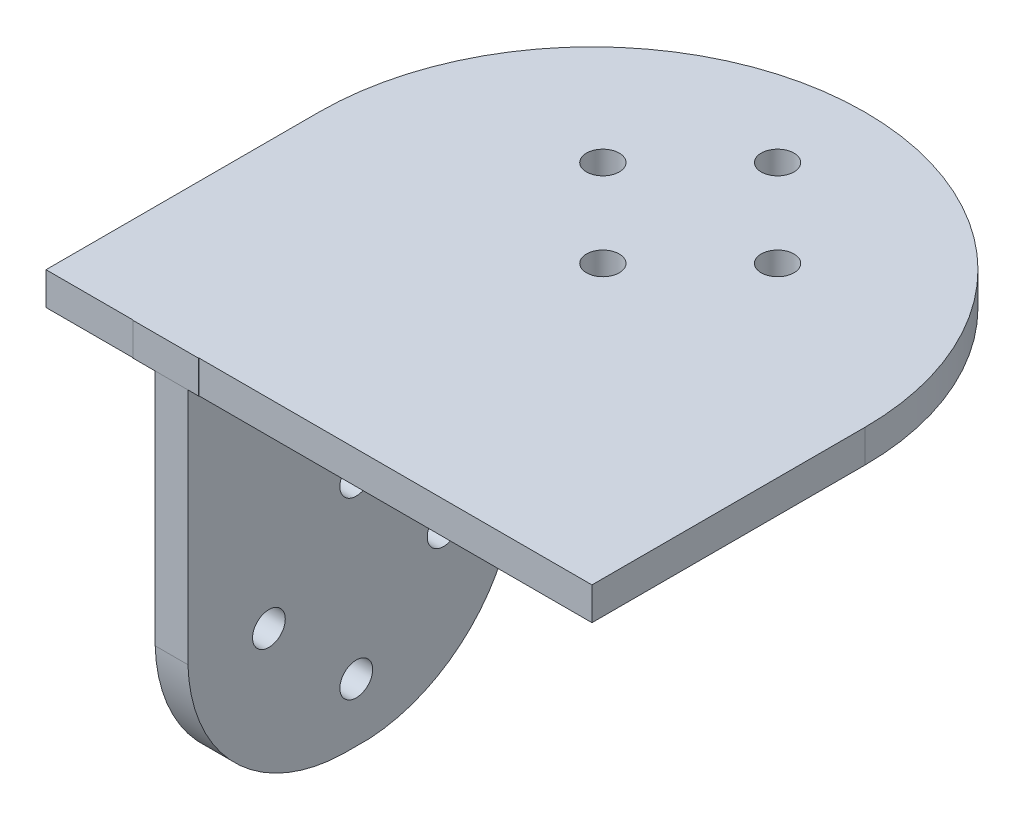
ISO-10303-21;
HEADER;
FILE_DESCRIPTION(('STEP AP214'),'2;1');
FILE_NAME('part.step','',(''),(''),'','','');
FILE_SCHEMA(('AUTOMOTIVE_DESIGN { 1 0 10303 214 1 1 1 1 }'));
ENDSEC;
DATA;
#1=APPLICATION_CONTEXT('core data for automotive mechanical design processes');
#2=APPLICATION_PROTOCOL_DEFINITION('international standard','automotive_design',2000,#1);
#3=PRODUCT_CONTEXT('',#1,'mechanical');
#4=PRODUCT('Part','Part','',(#3));
#5=PRODUCT_RELATED_PRODUCT_CATEGORY('part','',(#4));
#6=PRODUCT_DEFINITION_FORMATION('','',#4);
#7=PRODUCT_DEFINITION_CONTEXT('part definition',#1,'design');
#8=PRODUCT_DEFINITION('design','',#6,#7);
#9=PRODUCT_DEFINITION_SHAPE('','',#8);
#10=(LENGTH_UNIT() NAMED_UNIT(*) SI_UNIT(.MILLI.,.METRE.));
#11=(NAMED_UNIT(*) PLANE_ANGLE_UNIT() SI_UNIT($,.RADIAN.));
#12=(NAMED_UNIT(*) SI_UNIT($,.STERADIAN.) SOLID_ANGLE_UNIT());
#13=UNCERTAINTY_MEASURE_WITH_UNIT(LENGTH_MEASURE(1.E-05),#10,'distance_accuracy_value','');
#14=(GEOMETRIC_REPRESENTATION_CONTEXT(3) GLOBAL_UNCERTAINTY_ASSIGNED_CONTEXT((#13)) GLOBAL_UNIT_ASSIGNED_CONTEXT((#10,
#11,#12)) REPRESENTATION_CONTEXT('',''));
#15=CARTESIAN_POINT('',(0.,0.,0.));
#16=DIRECTION('',(0.,0.,1.));
#17=DIRECTION('',(1.,0.,0.));
#18=AXIS2_PLACEMENT_3D('',#15,#16,#17);
#19=CARTESIAN_POINT('',(25.,3.,25.));
#20=DIRECTION('',(0.,0.,-1.));
#21=DIRECTION('',(-1.,0.,0.));
#22=AXIS2_PLACEMENT_3D('',#19,#20,#21);
#23=PLANE('',#22);
#24=DIRECTION('',(1.,0.,0.));
#25=VECTOR('',#24,1.);
#26=CARTESIAN_POINT('',(25.,0.,25.));
#27=LINE('',#26,#25);
#28=CARTESIAN_POINT('',(-15.,0.,25.));
#29=VERTEX_POINT('',#28);
#30=CARTESIAN_POINT('',(-12.,0.,25.));
#31=VERTEX_POINT('',#30);
#32=EDGE_CURVE('E12',#29,#31,#27,.T.);
#33=ORIENTED_EDGE('',*,*,#32,.F.);
#34=DIRECTION('',(0.,1.,0.));
#35=VECTOR('',#34,1.);
#36=CARTESIAN_POINT('',(-15.,-36.,25.));
#37=LINE('',#36,#35);
#38=CARTESIAN_POINT('',(-15.,-21.8311766091495,25.));
#39=VERTEX_POINT('',#38);
#40=EDGE_CURVE('E260',#39,#29,#37,.T.);
#41=ORIENTED_EDGE('',*,*,#40,.F.);
#42=DIRECTION('',(1.,0.,0.));
#43=VECTOR('',#42,1.);
#44=CARTESIAN_POINT('',(-48.,-21.8311766091495,25.));
#45=LINE('',#44,#43);
#46=CARTESIAN_POINT('',(-12.,-21.8311766091495,25.));
#47=VERTEX_POINT('',#46);
#48=EDGE_CURVE('E229',#39,#47,#45,.T.);
#49=ORIENTED_EDGE('',*,*,#48,.T.);
#50=DIRECTION('',(0.,1.,0.));
#51=VECTOR('',#50,1.);
#52=CARTESIAN_POINT('',(-12.,-36.,25.));
#53=LINE('',#52,#51);
#54=EDGE_CURVE('E263',#47,#31,#53,.T.);
#55=ORIENTED_EDGE('',*,*,#54,.T.);
#56=EDGE_LOOP('',(#33,#41,#49,#55));
#57=FACE_BOUND('',#56,.T.);
#58=ADVANCED_FACE('F83',(#57),#23,.F.);
#59=DIRECTION('',(0.,1.,0.));
#60=VECTOR('',#59,1.);
#61=CARTESIAN_POINT('',(-11.,3.,25.));
#62=LINE('',#61,#60);
#63=CARTESIAN_POINT('',(-11.,0.,25.));
#64=VERTEX_POINT('',#63);
#65=CARTESIAN_POINT('',(-11.,3.,25.));
#66=VERTEX_POINT('',#65);
#67=EDGE_CURVE('E106',#64,#66,#62,.T.);
#68=ORIENTED_EDGE('',*,*,#67,.F.);
#69=DIRECTION('',(1.,0.,0.));
#70=VECTOR('',#69,1.);
#71=CARTESIAN_POINT('',(25.,0.,25.));
#72=LINE('',#71,#70);
#73=CARTESIAN_POINT('',(25.,0.,25.));
#74=VERTEX_POINT('',#73);
#75=EDGE_CURVE('E272',#64,#74,#72,.T.);
#76=ORIENTED_EDGE('',*,*,#75,.T.);
#77=DIRECTION('',(0.,-1.,0.));
#78=VECTOR('',#77,1.);
#79=CARTESIAN_POINT('',(25.,3.,25.));
#80=LINE('',#79,#78);
#81=CARTESIAN_POINT('',(25.,3.,25.));
#82=VERTEX_POINT('',#81);
#83=EDGE_CURVE('E318',#82,#74,#80,.T.);
#84=ORIENTED_EDGE('',*,*,#83,.F.);
#85=DIRECTION('',(1.,0.,0.));
#86=VECTOR('',#85,1.);
#87=CARTESIAN_POINT('',(25.,3.,25.));
#88=LINE('',#87,#86);
#89=EDGE_CURVE('E297',#66,#82,#88,.T.);
#90=ORIENTED_EDGE('',*,*,#89,.F.);
#91=EDGE_LOOP('',(#68,#76,#84,#90));
#92=FACE_BOUND('',#91,.T.);
#93=ADVANCED_FACE('F352',(#92),#23,.F.);
#94=CARTESIAN_POINT('',(-12.,-36.,0.));
#95=DIRECTION('',(-1.,0.,0.));
#96=DIRECTION('',(0.,0.,1.));
#97=AXIS2_PLACEMENT_3D('',#94,#95,#96);
#98=PLANE('',#97);
#99=CARTESIAN_POINT('',(-12.,-22.662353218597,1.58561866326079));
#100=DIRECTION('',(1.,0.,0.));
#101=DIRECTION('',(0.,0.,-1.));
#102=AXIS2_PLACEMENT_3D('',#99,#100,#101);
#103=CIRCLE('',#102,1.5);
#104=CARTESIAN_POINT('',(-12.,-22.662353218597,0.0856186632607896));
#105=VERTEX_POINT('',#104);
#106=EDGE_CURVE('E219',#105,#105,#103,.T.);
#107=ORIENTED_EDGE('',*,*,#106,.F.);
#108=EDGE_LOOP('',(#107));
#109=FACE_BOUND('',#108,.T.);
#110=CARTESIAN_POINT('',(-12.,-22.662353218597,17.5856186632608));
#111=DIRECTION('',(1.,0.,0.));
#112=DIRECTION('',(0.,0.,-1.));
#113=AXIS2_PLACEMENT_3D('',#110,#111,#112);
#114=CIRCLE('',#113,1.5);
#115=CARTESIAN_POINT('',(-12.,-22.662353218597,16.0856186632608));
#116=VERTEX_POINT('',#115);
#117=EDGE_CURVE('E215',#116,#116,#114,.T.);
#118=ORIENTED_EDGE('',*,*,#117,.F.);
#119=EDGE_LOOP('',(#118));
#120=FACE_BOUND('',#119,.T.);
#121=CARTESIAN_POINT('',(-12.,-30.662353218597,9.58561866326079));
#122=DIRECTION('',(1.,0.,0.));
#123=DIRECTION('',(0.,0.,-1.));
#124=AXIS2_PLACEMENT_3D('',#121,#122,#123);
#125=CIRCLE('',#124,1.5);
#126=CARTESIAN_POINT('',(-12.,-30.662353218597,8.08561866326079));
#127=VERTEX_POINT('',#126);
#128=EDGE_CURVE('E222',#127,#127,#125,.T.);
#129=ORIENTED_EDGE('',*,*,#128,.F.);
#130=EDGE_LOOP('',(#129));
#131=FACE_BOUND('',#130,.T.);
#132=ORIENTED_EDGE('',*,*,#54,.F.);
#133=CARTESIAN_POINT('',(-12.,-21.4155883033047,10.415588303375));
#134=DIRECTION('',(1.,0.,0.));
#135=DIRECTION('',(0.,0.,-1.));
#136=AXIS2_PLACEMENT_3D('',#133,#134,#135);
#137=CIRCLE('',#136,14.5903316678068);
#138=CARTESIAN_POINT('',(-12.,-36.,10.8311766067501));
#139=VERTEX_POINT('',#138);
#140=EDGE_CURVE('E227',#139,#47,#137,.F.);
#141=ORIENTED_EDGE('',*,*,#140,.F.);
#142=DIRECTION('',(0.,0.,1.));
#143=VECTOR('',#142,1.);
#144=CARTESIAN_POINT('',(-12.,-36.,0.));
#145=LINE('',#144,#143);
#146=CARTESIAN_POINT('',(-12.,-36.,8.33764678166806));
#147=VERTEX_POINT('',#146);
#148=EDGE_CURVE('E243',#147,#139,#145,.T.);
#149=ORIENTED_EDGE('',*,*,#148,.F.);
#150=CARTESIAN_POINT('',(-12.,-21.8311766091495,9.16882339083403));
#151=DIRECTION('',(1.,0.,0.));
#152=DIRECTION('',(0.,0.,-1.));
#153=AXIS2_PLACEMENT_3D('',#150,#151,#152);
#154=CIRCLE('',#153,14.1931818432915);
#155=CARTESIAN_POINT('',(-12.,-22.662353218597,-5.));
#156=VERTEX_POINT('',#155);
#157=EDGE_CURVE('E232',#156,#147,#154,.F.);
#158=ORIENTED_EDGE('',*,*,#157,.F.);
#159=DIRECTION('',(0.,1.,0.));
#160=VECTOR('',#159,1.);
#161=CARTESIAN_POINT('',(-12.,-36.,-5.));
#162=LINE('',#161,#160);
#163=CARTESIAN_POINT('',(-12.,0.,-5.));
#164=VERTEX_POINT('',#163);
#165=EDGE_CURVE('E266',#156,#164,#162,.T.);
#166=ORIENTED_EDGE('',*,*,#165,.T.);
#167=DIRECTION('',(0.,0.,1.));
#168=VECTOR('',#167,1.);
#169=CARTESIAN_POINT('',(-12.,0.,0.));
#170=LINE('',#169,#168);
#171=EDGE_CURVE('E254',#164,#31,#170,.T.);
#172=ORIENTED_EDGE('',*,*,#171,.T.);
#173=EDGE_LOOP('',(#132,#141,#149,#158,#166,#172));
#174=FACE_BOUND('',#173,.T.);
#175=CARTESIAN_POINT('',(-12.,-14.662353218597,9.58561866326079));
#176=DIRECTION('',(1.,0.,0.));
#177=DIRECTION('',(0.,0.,-1.));
#178=AXIS2_PLACEMENT_3D('',#175,#176,#177);
#179=CIRCLE('',#178,1.5);
#180=CARTESIAN_POINT('',(-12.,-14.662353218597,8.08561866326079));
#181=VERTEX_POINT('',#180);
#182=EDGE_CURVE('E218',#181,#181,#179,.T.);
#183=ORIENTED_EDGE('',*,*,#182,.F.);
#184=EDGE_LOOP('',(#183));
#185=FACE_BOUND('',#184,.T.);
#186=ADVANCED_FACE('F357',(#109,#120,#131,#174,#185),#98,.F.);
#187=CARTESIAN_POINT('',(-15.,-36.,0.));
#188=DIRECTION('',(1.,0.,0.));
#189=DIRECTION('',(0.,0.,-1.));
#190=AXIS2_PLACEMENT_3D('',#187,#188,#189);
#191=PLANE('',#190);
#192=CARTESIAN_POINT('',(-15.,-22.662353218597,1.58561866326079));
#193=DIRECTION('',(1.,0.,0.));
#194=DIRECTION('',(0.,0.,-1.));
#195=AXIS2_PLACEMENT_3D('',#192,#193,#194);
#196=CIRCLE('',#195,1.5);
#197=CARTESIAN_POINT('',(-15.,-22.662353218597,0.0856186632607896));
#198=VERTEX_POINT('',#197);
#199=EDGE_CURVE('E329',#198,#198,#196,.T.);
#200=ORIENTED_EDGE('',*,*,#199,.T.);
#201=EDGE_LOOP('',(#200));
#202=FACE_BOUND('',#201,.T.);
#203=CARTESIAN_POINT('',(-15.,-22.662353218597,17.5856186632608));
#204=DIRECTION('',(1.,0.,0.));
#205=DIRECTION('',(0.,0.,-1.));
#206=AXIS2_PLACEMENT_3D('',#203,#204,#205);
#207=CIRCLE('',#206,1.5);
#208=CARTESIAN_POINT('',(-15.,-22.662353218597,16.0856186632608));
#209=VERTEX_POINT('',#208);
#210=EDGE_CURVE('E242',#209,#209,#207,.T.);
#211=ORIENTED_EDGE('',*,*,#210,.T.);
#212=EDGE_LOOP('',(#211));
#213=FACE_BOUND('',#212,.T.);
#214=CARTESIAN_POINT('',(-15.,-30.662353218597,9.58561866326079));
#215=DIRECTION('',(1.,0.,0.));
#216=DIRECTION('',(0.,0.,-1.));
#217=AXIS2_PLACEMENT_3D('',#214,#215,#216);
#218=CIRCLE('',#217,1.5);
#219=CARTESIAN_POINT('',(-15.,-30.662353218597,8.08561866326079));
#220=VERTEX_POINT('',#219);
#221=EDGE_CURVE('E326',#220,#220,#218,.T.);
#222=ORIENTED_EDGE('',*,*,#221,.T.);
#223=EDGE_LOOP('',(#222));
#224=FACE_BOUND('',#223,.T.);
#225=DIRECTION('',(0.,0.,-1.));
#226=VECTOR('',#225,1.);
#227=CARTESIAN_POINT('',(-15.,-36.,0.));
#228=LINE('',#227,#226);
#229=CARTESIAN_POINT('',(-15.,-36.,10.8311766067501));
#230=VERTEX_POINT('',#229);
#231=CARTESIAN_POINT('',(-15.,-36.,8.33764678166806));
#232=VERTEX_POINT('',#231);
#233=EDGE_CURVE('E246',#230,#232,#228,.T.);
#234=ORIENTED_EDGE('',*,*,#233,.F.);
#235=CARTESIAN_POINT('',(-15.,-21.4155883033047,10.415588303375));
#236=DIRECTION('',(1.,0.,0.));
#237=DIRECTION('',(0.,0.,-1.));
#238=AXIS2_PLACEMENT_3D('',#235,#236,#237);
#239=CIRCLE('',#238,14.5903316678068);
#240=EDGE_CURVE('E239',#230,#39,#239,.F.);
#241=ORIENTED_EDGE('',*,*,#240,.T.);
#242=ORIENTED_EDGE('',*,*,#40,.T.);
#243=DIRECTION('',(0.,0.,-1.));
#244=VECTOR('',#243,1.);
#245=CARTESIAN_POINT('',(-15.,0.,0.));
#246=LINE('',#245,#244);
#247=CARTESIAN_POINT('',(-15.,0.,-5.));
#248=VERTEX_POINT('',#247);
#249=EDGE_CURVE('E247',#29,#248,#246,.T.);
#250=ORIENTED_EDGE('',*,*,#249,.T.);
#251=DIRECTION('',(0.,1.,0.));
#252=VECTOR('',#251,1.);
#253=CARTESIAN_POINT('',(-15.,-36.,-5.));
#254=LINE('',#253,#252);
#255=CARTESIAN_POINT('',(-15.,-22.662353218597,-5.));
#256=VERTEX_POINT('',#255);
#257=EDGE_CURVE('E250',#256,#248,#254,.T.);
#258=ORIENTED_EDGE('',*,*,#257,.F.);
#259=CARTESIAN_POINT('',(-15.,-21.8311766091495,9.16882339083403));
#260=DIRECTION('',(1.,0.,0.));
#261=DIRECTION('',(0.,0.,-1.));
#262=AXIS2_PLACEMENT_3D('',#259,#260,#261);
#263=CIRCLE('',#262,14.1931818432915);
#264=EDGE_CURVE('E236',#256,#232,#263,.F.);
#265=ORIENTED_EDGE('',*,*,#264,.T.);
#266=EDGE_LOOP('',(#234,#241,#242,#250,#258,#265));
#267=FACE_BOUND('',#266,.T.);
#268=CARTESIAN_POINT('',(-15.,-14.662353218597,9.58561866326079));
#269=DIRECTION('',(1.,0.,0.));
#270=DIRECTION('',(0.,0.,-1.));
#271=AXIS2_PLACEMENT_3D('',#268,#269,#270);
#272=CIRCLE('',#271,1.5);
#273=CARTESIAN_POINT('',(-15.,-14.662353218597,8.08561866326079));
#274=VERTEX_POINT('',#273);
#275=EDGE_CURVE('E255',#274,#274,#272,.T.);
#276=ORIENTED_EDGE('',*,*,#275,.T.);
#277=EDGE_LOOP('',(#276));
#278=FACE_BOUND('',#277,.T.);
#279=ADVANCED_FACE('F334',(#202,#213,#224,#267,#278),#191,.F.);
#280=CARTESIAN_POINT('',(0.,0.,0.));
#281=DIRECTION('',(0.,1.,0.));
#282=DIRECTION('',(0.,0.,1.));
#283=AXIS2_PLACEMENT_3D('',#280,#281,#282);
#284=PLANE('',#283);
#285=DIRECTION('',(1.,0.,0.));
#286=VECTOR('',#285,1.);
#287=CARTESIAN_POINT('',(0.,0.,-5.));
#288=LINE('',#287,#286);
#289=EDGE_CURVE('E251',#248,#164,#288,.T.);
#290=ORIENTED_EDGE('',*,*,#289,.F.);
#291=ORIENTED_EDGE('',*,*,#249,.F.);
#292=ORIENTED_EDGE('',*,*,#32,.T.);
#293=ORIENTED_EDGE('',*,*,#171,.F.);
#294=EDGE_LOOP('',(#290,#291,#292,#293));
#295=FACE_BOUND('',#294,.T.);
#296=DIRECTION('',(0.,0.,1.));
#297=VECTOR('',#296,1.);
#298=CARTESIAN_POINT('',(-17.,0.,0.));
#299=LINE('',#298,#297);
#300=CARTESIAN_POINT('',(-17.,0.,25.));
#301=VERTEX_POINT('',#300);
#302=CARTESIAN_POINT('',(-17.,0.,25.0332934627977));
#303=VERTEX_POINT('',#302);
#304=EDGE_CURVE('E184',#301,#303,#299,.T.);
#305=ORIENTED_EDGE('',*,*,#304,.F.);
#306=CARTESIAN_POINT('',(-25.,0.,25.));
#307=VERTEX_POINT('',#306);
#308=EDGE_CURVE('E98',#307,#301,#72,.T.);
#309=ORIENTED_EDGE('',*,*,#308,.F.);
#310=DIRECTION('',(0.,0.,1.));
#311=VECTOR('',#310,1.);
#312=CARTESIAN_POINT('',(-25.,0.,0.));
#313=LINE('',#312,#311);
#314=CARTESIAN_POINT('',(-25.,0.,0.));
#315=VERTEX_POINT('',#314);
#316=EDGE_CURVE('E309',#315,#307,#313,.T.);
#317=ORIENTED_EDGE('',*,*,#316,.F.);
#318=CARTESIAN_POINT('',(0.,0.,0.));
#319=DIRECTION('',(0.,1.,0.));
#320=DIRECTION('',(0.,0.,1.));
#321=AXIS2_PLACEMENT_3D('',#318,#319,#320);
#322=CIRCLE('',#321,25.);
#323=CARTESIAN_POINT('',(25.,0.,0.));
#324=VERTEX_POINT('',#323);
#325=EDGE_CURVE('E307',#324,#315,#322,.T.);
#326=ORIENTED_EDGE('',*,*,#325,.F.);
#327=DIRECTION('',(0.,0.,-1.));
#328=VECTOR('',#327,1.);
#329=CARTESIAN_POINT('',(25.,0.,0.));
#330=LINE('',#329,#328);
#331=EDGE_CURVE('E305',#74,#324,#330,.T.);
#332=ORIENTED_EDGE('',*,*,#331,.F.);
#333=ORIENTED_EDGE('',*,*,#75,.F.);
#334=DIRECTION('',(0.,0.,1.));
#335=VECTOR('',#334,1.);
#336=CARTESIAN_POINT('',(-11.,0.,0.));
#337=LINE('',#336,#335);
#338=CARTESIAN_POINT('',(-11.,0.,25.0332934627977));
#339=VERTEX_POINT('',#338);
#340=EDGE_CURVE('E207',#64,#339,#337,.T.);
#341=ORIENTED_EDGE('',*,*,#340,.T.);
#342=DIRECTION('',(1.,0.,0.));
#343=VECTOR('',#342,1.);
#344=CARTESIAN_POINT('',(-17.,0.,25.0332934627977));
#345=LINE('',#344,#343);
#346=EDGE_CURVE('E198',#303,#339,#345,.T.);
#347=ORIENTED_EDGE('',*,*,#346,.F.);
#348=EDGE_LOOP('',(#305,#309,#317,#326,#332,#333,#341,#347));
#349=FACE_BOUND('',#348,.T.);
#350=CARTESIAN_POINT('',(-8.,0.,-9.));
#351=DIRECTION('',(0.,-1.,0.));
#352=DIRECTION('',(0.,0.,-1.));
#353=AXIS2_PLACEMENT_3D('',#350,#351,#352);
#354=CIRCLE('',#353,1.5);
#355=CARTESIAN_POINT('',(-8.,0.,-10.5));
#356=VERTEX_POINT('',#355);
#357=EDGE_CURVE('E273',#356,#356,#354,.T.);
#358=ORIENTED_EDGE('',*,*,#357,.F.);
#359=EDGE_LOOP('',(#358));
#360=FACE_BOUND('',#359,.T.);
#361=CARTESIAN_POINT('',(0.,0.,-0.999999999999999));
#362=DIRECTION('',(0.,-1.,0.));
#363=DIRECTION('',(0.,0.,-1.));
#364=AXIS2_PLACEMENT_3D('',#361,#362,#363);
#365=CIRCLE('',#364,1.5);
#366=CARTESIAN_POINT('',(0.,0.,-2.5));
#367=VERTEX_POINT('',#366);
#368=EDGE_CURVE('E276',#367,#367,#365,.T.);
#369=ORIENTED_EDGE('',*,*,#368,.F.);
#370=EDGE_LOOP('',(#369));
#371=FACE_BOUND('',#370,.T.);
#372=CARTESIAN_POINT('',(0.,0.,-17.));
#373=DIRECTION('',(0.,-1.,0.));
#374=DIRECTION('',(0.,0.,-1.));
#375=AXIS2_PLACEMENT_3D('',#372,#373,#374);
#376=CIRCLE('',#375,1.5);
#377=CARTESIAN_POINT('',(0.,0.,-18.5));
#378=VERTEX_POINT('',#377);
#379=EDGE_CURVE('E282',#378,#378,#376,.T.);
#380=ORIENTED_EDGE('',*,*,#379,.F.);
#381=EDGE_LOOP('',(#380));
#382=FACE_BOUND('',#381,.T.);
#383=CARTESIAN_POINT('',(8.,0.,-9.));
#384=DIRECTION('',(0.,-1.,0.));
#385=DIRECTION('',(0.,0.,-1.));
#386=AXIS2_PLACEMENT_3D('',#383,#384,#385);
#387=CIRCLE('',#386,1.5);
#388=CARTESIAN_POINT('',(8.,0.,-10.5));
#389=VERTEX_POINT('',#388);
#390=EDGE_CURVE('E288',#389,#389,#387,.T.);
#391=ORIENTED_EDGE('',*,*,#390,.F.);
#392=EDGE_LOOP('',(#391));
#393=FACE_BOUND('',#392,.T.);
#394=ADVANCED_FACE('F204',(#295,#349,#360,#371,#382,#393),#284,.F.);
#395=ORIENTED_EDGE('',*,*,#308,.T.);
#396=DIRECTION('',(0.,1.,0.));
#397=VECTOR('',#396,1.);
#398=CARTESIAN_POINT('',(-17.,3.,25.));
#399=LINE('',#398,#397);
#400=CARTESIAN_POINT('',(-17.,3.,25.));
#401=VERTEX_POINT('',#400);
#402=EDGE_CURVE('E190',#301,#401,#399,.T.);
#403=ORIENTED_EDGE('',*,*,#402,.T.);
#404=CARTESIAN_POINT('',(-25.,3.,25.));
#405=VERTEX_POINT('',#404);
#406=EDGE_CURVE('E293',#405,#401,#88,.T.);
#407=ORIENTED_EDGE('',*,*,#406,.F.);
#408=DIRECTION('',(0.,-1.,0.));
#409=VECTOR('',#408,1.);
#410=CARTESIAN_POINT('',(-25.,3.,25.));
#411=LINE('',#410,#409);
#412=EDGE_CURVE('E303',#405,#307,#411,.T.);
#413=ORIENTED_EDGE('',*,*,#412,.T.);
#414=EDGE_LOOP('',(#395,#403,#407,#413));
#415=FACE_BOUND('',#414,.T.);
#416=ADVANCED_FACE('F85',(#415),#23,.F.);
#417=CARTESIAN_POINT('',(25.,3.,0.));
#418=DIRECTION('',(-1.,0.,0.));
#419=DIRECTION('',(0.,0.,1.));
#420=AXIS2_PLACEMENT_3D('',#417,#418,#419);
#421=PLANE('',#420);
#422=ORIENTED_EDGE('',*,*,#331,.T.);
#423=DIRECTION('',(0.,-1.,0.));
#424=VECTOR('',#423,1.);
#425=CARTESIAN_POINT('',(25.,3.,0.));
#426=LINE('',#425,#424);
#427=CARTESIAN_POINT('',(25.,3.,0.));
#428=VERTEX_POINT('',#427);
#429=EDGE_CURVE('E315',#428,#324,#426,.T.);
#430=ORIENTED_EDGE('',*,*,#429,.F.);
#431=DIRECTION('',(0.,0.,-1.));
#432=VECTOR('',#431,1.);
#433=CARTESIAN_POINT('',(25.,3.,0.));
#434=LINE('',#433,#432);
#435=EDGE_CURVE('E296',#82,#428,#434,.T.);
#436=ORIENTED_EDGE('',*,*,#435,.F.);
#437=ORIENTED_EDGE('',*,*,#83,.T.);
#438=EDGE_LOOP('',(#422,#430,#436,#437));
#439=FACE_BOUND('',#438,.T.);
#440=ADVANCED_FACE('F359',(#439),#421,.F.);
#441=CARTESIAN_POINT('',(0.,3.,0.));
#442=DIRECTION('',(0.,-1.,0.));
#443=DIRECTION('',(0.,0.,-1.));
#444=AXIS2_PLACEMENT_3D('',#441,#442,#443);
#445=CYLINDRICAL_SURFACE('',#444,25.);
#446=ORIENTED_EDGE('',*,*,#325,.T.);
#447=DIRECTION('',(0.,-1.,0.));
#448=VECTOR('',#447,1.);
#449=CARTESIAN_POINT('',(-25.,3.,0.));
#450=LINE('',#449,#448);
#451=CARTESIAN_POINT('',(-25.,3.,0.));
#452=VERTEX_POINT('',#451);
#453=EDGE_CURVE('E312',#452,#315,#450,.T.);
#454=ORIENTED_EDGE('',*,*,#453,.F.);
#455=CARTESIAN_POINT('',(0.,3.,0.));
#456=DIRECTION('',(0.,1.,0.));
#457=DIRECTION('',(0.,0.,1.));
#458=AXIS2_PLACEMENT_3D('',#455,#456,#457);
#459=CIRCLE('',#458,25.);
#460=EDGE_CURVE('E299',#428,#452,#459,.T.);
#461=ORIENTED_EDGE('',*,*,#460,.F.);
#462=ORIENTED_EDGE('',*,*,#429,.T.);
#463=EDGE_LOOP('',(#446,#454,#461,#462));
#464=FACE_BOUND('',#463,.T.);
#465=ADVANCED_FACE('F364',(#464),#445,.T.);
#466=CARTESIAN_POINT('',(-25.,3.,0.));
#467=DIRECTION('',(1.,0.,0.));
#468=DIRECTION('',(0.,0.,-1.));
#469=AXIS2_PLACEMENT_3D('',#466,#467,#468);
#470=PLANE('',#469);
#471=ORIENTED_EDGE('',*,*,#316,.T.);
#472=ORIENTED_EDGE('',*,*,#412,.F.);
#473=DIRECTION('',(0.,0.,1.));
#474=VECTOR('',#473,1.);
#475=CARTESIAN_POINT('',(-25.,3.,0.));
#476=LINE('',#475,#474);
#477=EDGE_CURVE('E301',#452,#405,#476,.T.);
#478=ORIENTED_EDGE('',*,*,#477,.F.);
#479=ORIENTED_EDGE('',*,*,#453,.T.);
#480=EDGE_LOOP('',(#471,#472,#478,#479));
#481=FACE_BOUND('',#480,.T.);
#482=ADVANCED_FACE('F378',(#481),#470,.F.);
#483=CARTESIAN_POINT('',(0.,3.,0.));
#484=DIRECTION('',(0.,1.,0.));
#485=DIRECTION('',(0.,0.,1.));
#486=AXIS2_PLACEMENT_3D('',#483,#484,#485);
#487=PLANE('',#486);
#488=ORIENTED_EDGE('',*,*,#406,.T.);
#489=DIRECTION('',(0.,0.,-1.));
#490=VECTOR('',#489,1.);
#491=CARTESIAN_POINT('',(-17.,3.,0.));
#492=LINE('',#491,#490);
#493=CARTESIAN_POINT('',(-17.,3.,25.0332934627977));
#494=VERTEX_POINT('',#493);
#495=EDGE_CURVE('E202',#494,#401,#492,.T.);
#496=ORIENTED_EDGE('',*,*,#495,.F.);
#497=DIRECTION('',(1.,0.,0.));
#498=VECTOR('',#497,1.);
#499=CARTESIAN_POINT('',(-17.,3.,25.0332934627977));
#500=LINE('',#499,#498);
#501=CARTESIAN_POINT('',(-11.,3.,25.0332934627977));
#502=VERTEX_POINT('',#501);
#503=EDGE_CURVE('E200',#494,#502,#500,.T.);
#504=ORIENTED_EDGE('',*,*,#503,.T.);
#505=DIRECTION('',(0.,0.,-1.));
#506=VECTOR('',#505,1.);
#507=CARTESIAN_POINT('',(-11.,3.,0.));
#508=LINE('',#507,#506);
#509=EDGE_CURVE('E193',#502,#66,#508,.T.);
#510=ORIENTED_EDGE('',*,*,#509,.T.);
#511=ORIENTED_EDGE('',*,*,#89,.T.);
#512=ORIENTED_EDGE('',*,*,#435,.T.);
#513=ORIENTED_EDGE('',*,*,#460,.T.);
#514=ORIENTED_EDGE('',*,*,#477,.T.);
#515=EDGE_LOOP('',(#488,#496,#504,#510,#511,#512,#513,#514));
#516=FACE_BOUND('',#515,.T.);
#517=CARTESIAN_POINT('',(-8.,3.,-9.));
#518=DIRECTION('',(0.,-1.,0.));
#519=DIRECTION('',(0.,0.,-1.));
#520=AXIS2_PLACEMENT_3D('',#517,#518,#519);
#521=CIRCLE('',#520,1.5);
#522=CARTESIAN_POINT('',(-8.,3.,-10.5));
#523=VERTEX_POINT('',#522);
#524=EDGE_CURVE('E269',#523,#523,#521,.T.);
#525=ORIENTED_EDGE('',*,*,#524,.T.);
#526=EDGE_LOOP('',(#525));
#527=FACE_BOUND('',#526,.T.);
#528=CARTESIAN_POINT('',(0.,3.,-0.999999999999999));
#529=DIRECTION('',(0.,-1.,0.));
#530=DIRECTION('',(0.,0.,-1.));
#531=AXIS2_PLACEMENT_3D('',#528,#529,#530);
#532=CIRCLE('',#531,1.5);
#533=CARTESIAN_POINT('',(0.,3.,-2.5));
#534=VERTEX_POINT('',#533);
#535=EDGE_CURVE('E279',#534,#534,#532,.T.);
#536=ORIENTED_EDGE('',*,*,#535,.T.);
#537=EDGE_LOOP('',(#536));
#538=FACE_BOUND('',#537,.T.);
#539=CARTESIAN_POINT('',(0.,3.,-17.));
#540=DIRECTION('',(0.,-1.,0.));
#541=DIRECTION('',(0.,0.,-1.));
#542=AXIS2_PLACEMENT_3D('',#539,#540,#541);
#543=CIRCLE('',#542,1.5);
#544=CARTESIAN_POINT('',(0.,3.,-18.5));
#545=VERTEX_POINT('',#544);
#546=EDGE_CURVE('E285',#545,#545,#543,.T.);
#547=ORIENTED_EDGE('',*,*,#546,.T.);
#548=EDGE_LOOP('',(#547));
#549=FACE_BOUND('',#548,.T.);
#550=CARTESIAN_POINT('',(8.,3.,-9.));
#551=DIRECTION('',(0.,-1.,0.));
#552=DIRECTION('',(0.,0.,-1.));
#553=AXIS2_PLACEMENT_3D('',#550,#551,#552);
#554=CIRCLE('',#553,1.5);
#555=CARTESIAN_POINT('',(8.,3.,-10.5));
#556=VERTEX_POINT('',#555);
#557=EDGE_CURVE('E268',#556,#556,#554,.T.);
#558=ORIENTED_EDGE('',*,*,#557,.T.);
#559=EDGE_LOOP('',(#558));
#560=FACE_BOUND('',#559,.T.);
#561=ADVANCED_FACE('F376',(#516,#527,#538,#549,#560),#487,.T.);
#562=CARTESIAN_POINT('',(8.,3.,-9.));
#563=DIRECTION('',(0.,-1.,0.));
#564=DIRECTION('',(0.,0.,-1.));
#565=AXIS2_PLACEMENT_3D('',#562,#563,#564);
#566=CYLINDRICAL_SURFACE('',#565,1.5);
#567=ORIENTED_EDGE('',*,*,#557,.F.);
#568=EDGE_LOOP('',(#567));
#569=FACE_BOUND('',#568,.T.);
#570=ORIENTED_EDGE('',*,*,#390,.T.);
#571=EDGE_LOOP('',(#570));
#572=FACE_BOUND('',#571,.T.);
#573=ADVANCED_FACE('F474',(#569,#572),#566,.F.);
#574=CARTESIAN_POINT('',(0.,3.,-17.));
#575=DIRECTION('',(0.,-1.,0.));
#576=DIRECTION('',(0.,0.,-1.));
#577=AXIS2_PLACEMENT_3D('',#574,#575,#576);
#578=CYLINDRICAL_SURFACE('',#577,1.5);
#579=ORIENTED_EDGE('',*,*,#546,.F.);
#580=EDGE_LOOP('',(#579));
#581=FACE_BOUND('',#580,.T.);
#582=ORIENTED_EDGE('',*,*,#379,.T.);
#583=EDGE_LOOP('',(#582));
#584=FACE_BOUND('',#583,.T.);
#585=ADVANCED_FACE('F471',(#581,#584),#578,.F.);
#586=CARTESIAN_POINT('',(0.,3.,-0.999999999999999));
#587=DIRECTION('',(0.,-1.,0.));
#588=DIRECTION('',(0.,0.,-1.));
#589=AXIS2_PLACEMENT_3D('',#586,#587,#588);
#590=CYLINDRICAL_SURFACE('',#589,1.5);
#591=ORIENTED_EDGE('',*,*,#535,.F.);
#592=EDGE_LOOP('',(#591));
#593=FACE_BOUND('',#592,.T.);
#594=ORIENTED_EDGE('',*,*,#368,.T.);
#595=EDGE_LOOP('',(#594));
#596=FACE_BOUND('',#595,.T.);
#597=ADVANCED_FACE('F467',(#593,#596),#590,.F.);
#598=CARTESIAN_POINT('',(-8.,3.,-9.));
#599=DIRECTION('',(0.,-1.,0.));
#600=DIRECTION('',(0.,0.,-1.));
#601=AXIS2_PLACEMENT_3D('',#598,#599,#600);
#602=CYLINDRICAL_SURFACE('',#601,1.5);
#603=ORIENTED_EDGE('',*,*,#524,.F.);
#604=EDGE_LOOP('',(#603));
#605=FACE_BOUND('',#604,.T.);
#606=ORIENTED_EDGE('',*,*,#357,.T.);
#607=EDGE_LOOP('',(#606));
#608=FACE_BOUND('',#607,.T.);
#609=ADVANCED_FACE('F464',(#605,#608),#602,.F.);
#610=CARTESIAN_POINT('',(0.,-36.,-5.));
#611=DIRECTION('',(0.,0.,1.));
#612=DIRECTION('',(1.,0.,0.));
#613=AXIS2_PLACEMENT_3D('',#610,#611,#612);
#614=PLANE('',#613);
#615=ORIENTED_EDGE('',*,*,#165,.F.);
#616=DIRECTION('',(1.,0.,0.));
#617=VECTOR('',#616,1.);
#618=CARTESIAN_POINT('',(-48.,-22.662353218597,-5.));
#619=LINE('',#618,#617);
#620=EDGE_CURVE('E234',#256,#156,#619,.T.);
#621=ORIENTED_EDGE('',*,*,#620,.F.);
#622=ORIENTED_EDGE('',*,*,#257,.T.);
#623=ORIENTED_EDGE('',*,*,#289,.T.);
#624=EDGE_LOOP('',(#615,#621,#622,#623));
#625=FACE_BOUND('',#624,.T.);
#626=ADVANCED_FACE('F450',(#625),#614,.F.);
#627=CARTESIAN_POINT('',(0.,-36.,0.));
#628=DIRECTION('',(0.,-1.,0.));
#629=DIRECTION('',(0.,0.,-1.));
#630=AXIS2_PLACEMENT_3D('',#627,#628,#629);
#631=PLANE('',#630);
#632=DIRECTION('',(1.,0.,0.));
#633=VECTOR('',#632,1.);
#634=CARTESIAN_POINT('',(-48.,-36.,10.8311766067501));
#635=LINE('',#634,#633);
#636=EDGE_CURVE('E91',#230,#139,#635,.T.);
#637=ORIENTED_EDGE('',*,*,#636,.F.);
#638=ORIENTED_EDGE('',*,*,#233,.T.);
#639=DIRECTION('',(1.,0.,0.));
#640=VECTOR('',#639,1.);
#641=CARTESIAN_POINT('',(-48.,-36.,8.33764678166806));
#642=LINE('',#641,#640);
#643=EDGE_CURVE('E321',#147,#232,#642,.F.);
#644=ORIENTED_EDGE('',*,*,#643,.F.);
#645=ORIENTED_EDGE('',*,*,#148,.T.);
#646=EDGE_LOOP('',(#637,#638,#644,#645));
#647=FACE_BOUND('',#646,.T.);
#648=ADVANCED_FACE('F438',(#647),#631,.T.);
#649=CARTESIAN_POINT('',(-48.,-21.8311766091495,9.16882339083403));
#650=DIRECTION('',(1.,0.,0.));
#651=DIRECTION('',(0.,0.,-1.));
#652=AXIS2_PLACEMENT_3D('',#649,#650,#651);
#653=CYLINDRICAL_SURFACE('',#652,14.1931818432915);
#654=ORIENTED_EDGE('',*,*,#620,.T.);
#655=ORIENTED_EDGE('',*,*,#157,.T.);
#656=ORIENTED_EDGE('',*,*,#643,.T.);
#657=ORIENTED_EDGE('',*,*,#264,.F.);
#658=EDGE_LOOP('',(#654,#655,#656,#657));
#659=FACE_BOUND('',#658,.T.);
#660=ADVANCED_FACE('F422',(#659),#653,.T.);
#661=CARTESIAN_POINT('',(-48.,-21.4155883033047,10.415588303375));
#662=DIRECTION('',(1.,0.,0.));
#663=DIRECTION('',(0.,0.,-1.));
#664=AXIS2_PLACEMENT_3D('',#661,#662,#663);
#665=CYLINDRICAL_SURFACE('',#664,14.5903316678068);
#666=ORIENTED_EDGE('',*,*,#636,.T.);
#667=ORIENTED_EDGE('',*,*,#140,.T.);
#668=ORIENTED_EDGE('',*,*,#48,.F.);
#669=ORIENTED_EDGE('',*,*,#240,.F.);
#670=EDGE_LOOP('',(#666,#667,#668,#669));
#671=FACE_BOUND('',#670,.T.);
#672=ADVANCED_FACE('F415',(#671),#665,.T.);
#673=CARTESIAN_POINT('',(-48.,-22.662353218597,17.5856186632608));
#674=DIRECTION('',(1.,0.,0.));
#675=DIRECTION('',(0.,0.,-1.));
#676=AXIS2_PLACEMENT_3D('',#673,#674,#675);
#677=CYLINDRICAL_SURFACE('',#676,1.5);
#678=ORIENTED_EDGE('',*,*,#117,.T.);
#679=EDGE_LOOP('',(#678));
#680=FACE_BOUND('',#679,.T.);
#681=ORIENTED_EDGE('',*,*,#210,.F.);
#682=EDGE_LOOP('',(#681));
#683=FACE_BOUND('',#682,.T.);
#684=ADVANCED_FACE('F413',(#680,#683),#677,.F.);
#685=CARTESIAN_POINT('',(-48.,-30.662353218597,9.58561866326079));
#686=DIRECTION('',(1.,0.,0.));
#687=DIRECTION('',(0.,0.,-1.));
#688=AXIS2_PLACEMENT_3D('',#685,#686,#687);
#689=CYLINDRICAL_SURFACE('',#688,1.5);
#690=ORIENTED_EDGE('',*,*,#128,.T.);
#691=EDGE_LOOP('',(#690));
#692=FACE_BOUND('',#691,.T.);
#693=ORIENTED_EDGE('',*,*,#221,.F.);
#694=EDGE_LOOP('',(#693));
#695=FACE_BOUND('',#694,.T.);
#696=ADVANCED_FACE('F347',(#692,#695),#689,.F.);
#697=CARTESIAN_POINT('',(-48.,-22.662353218597,1.58561866326079));
#698=DIRECTION('',(1.,0.,0.));
#699=DIRECTION('',(0.,0.,-1.));
#700=AXIS2_PLACEMENT_3D('',#697,#698,#699);
#701=CYLINDRICAL_SURFACE('',#700,1.5);
#702=ORIENTED_EDGE('',*,*,#106,.T.);
#703=EDGE_LOOP('',(#702));
#704=FACE_BOUND('',#703,.T.);
#705=ORIENTED_EDGE('',*,*,#199,.F.);
#706=EDGE_LOOP('',(#705));
#707=FACE_BOUND('',#706,.T.);
#708=ADVANCED_FACE('F338',(#704,#707),#701,.F.);
#709=CARTESIAN_POINT('',(-48.,-14.662353218597,9.58561866326079));
#710=DIRECTION('',(1.,0.,0.));
#711=DIRECTION('',(0.,0.,-1.));
#712=AXIS2_PLACEMENT_3D('',#709,#710,#711);
#713=CYLINDRICAL_SURFACE('',#712,1.5);
#714=ORIENTED_EDGE('',*,*,#182,.T.);
#715=EDGE_LOOP('',(#714));
#716=FACE_BOUND('',#715,.T.);
#717=ORIENTED_EDGE('',*,*,#275,.F.);
#718=EDGE_LOOP('',(#717));
#719=FACE_BOUND('',#718,.T.);
#720=ADVANCED_FACE('F336',(#716,#719),#713,.F.);
#721=CARTESIAN_POINT('',(-17.,0.,0.));
#722=DIRECTION('',(-1.,0.,0.));
#723=DIRECTION('',(0.,0.,1.));
#724=AXIS2_PLACEMENT_3D('',#721,#722,#723);
#725=PLANE('',#724);
#726=ORIENTED_EDGE('',*,*,#402,.F.);
#727=ORIENTED_EDGE('',*,*,#304,.T.);
#728=DIRECTION('',(0.,1.,0.));
#729=VECTOR('',#728,1.);
#730=CARTESIAN_POINT('',(-17.,0.,25.0332934627977));
#731=LINE('',#730,#729);
#732=EDGE_CURVE('E188',#303,#494,#731,.T.);
#733=ORIENTED_EDGE('',*,*,#732,.T.);
#734=ORIENTED_EDGE('',*,*,#495,.T.);
#735=EDGE_LOOP('',(#726,#727,#733,#734));
#736=FACE_BOUND('',#735,.T.);
#737=ADVANCED_FACE('F186',(#736),#725,.T.);
#738=CARTESIAN_POINT('',(-11.,0.,0.));
#739=DIRECTION('',(-1.,0.,0.));
#740=DIRECTION('',(0.,0.,1.));
#741=AXIS2_PLACEMENT_3D('',#738,#739,#740);
#742=PLANE('',#741);
#743=ORIENTED_EDGE('',*,*,#340,.F.);
#744=ORIENTED_EDGE('',*,*,#67,.T.);
#745=ORIENTED_EDGE('',*,*,#509,.F.);
#746=DIRECTION('',(0.,1.,0.));
#747=VECTOR('',#746,1.);
#748=CARTESIAN_POINT('',(-11.,0.,25.0332934627977));
#749=LINE('',#748,#747);
#750=EDGE_CURVE('E402',#339,#502,#749,.T.);
#751=ORIENTED_EDGE('',*,*,#750,.F.);
#752=EDGE_LOOP('',(#743,#744,#745,#751));
#753=FACE_BOUND('',#752,.T.);
#754=ADVANCED_FACE('F345',(#753),#742,.F.);
#755=CARTESIAN_POINT('',(-17.,0.,25.0332934627977));
#756=DIRECTION('',(0.,0.,-1.));
#757=DIRECTION('',(-1.,0.,0.));
#758=AXIS2_PLACEMENT_3D('',#755,#756,#757);
#759=PLANE('',#758);
#760=ORIENTED_EDGE('',*,*,#750,.T.);
#761=ORIENTED_EDGE('',*,*,#503,.F.);
#762=ORIENTED_EDGE('',*,*,#732,.F.);
#763=ORIENTED_EDGE('',*,*,#346,.T.);
#764=EDGE_LOOP('',(#760,#761,#762,#763));
#765=FACE_BOUND('',#764,.T.);
#766=ADVANCED_FACE('F197',(#765),#759,.F.);
#767=CLOSED_SHELL('',(#58,#93,#186,#279,#394,#416,#440,#465,#482,#561,#573,#585,#597,#609,#626,
#648,#660,#672,#684,#696,#708,#720,#737,#754,#766));
#768=MANIFOLD_SOLID_BREP('B2',#767);
#769=ADVANCED_BREP_SHAPE_REPRESENTATION('',(#18,#768),#14);
#770=SHAPE_DEFINITION_REPRESENTATION(#9,#769);
ENDSEC;
END-ISO-10303-21;
